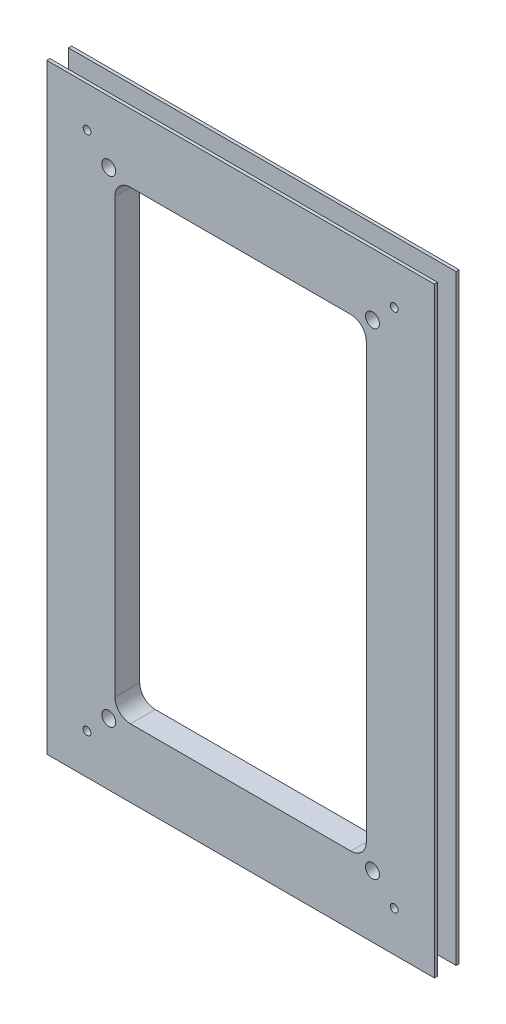
ISO-10303-21;
HEADER;
FILE_DESCRIPTION(('STEP AP214'),'2;1');
FILE_NAME('part.step','',(''),(''),'','','');
FILE_SCHEMA(('AUTOMOTIVE_DESIGN { 1 0 10303 214 1 1 1 1 }'));
ENDSEC;
DATA;
#1=APPLICATION_CONTEXT('core data for automotive mechanical design processes');
#2=APPLICATION_PROTOCOL_DEFINITION('international standard','automotive_design',2000,#1);
#3=PRODUCT_CONTEXT('',#1,'mechanical');
#4=PRODUCT('Part','Part','',(#3));
#5=PRODUCT_RELATED_PRODUCT_CATEGORY('part','',(#4));
#6=PRODUCT_DEFINITION_FORMATION('','',#4);
#7=PRODUCT_DEFINITION_CONTEXT('part definition',#1,'design');
#8=PRODUCT_DEFINITION('design','',#6,#7);
#9=PRODUCT_DEFINITION_SHAPE('','',#8);
#10=(LENGTH_UNIT() NAMED_UNIT(*) SI_UNIT(.MILLI.,.METRE.));
#11=(NAMED_UNIT(*) PLANE_ANGLE_UNIT() SI_UNIT($,.RADIAN.));
#12=(NAMED_UNIT(*) SI_UNIT($,.STERADIAN.) SOLID_ANGLE_UNIT());
#13=UNCERTAINTY_MEASURE_WITH_UNIT(LENGTH_MEASURE(1.E-05),#10,'distance_accuracy_value','');
#14=(GEOMETRIC_REPRESENTATION_CONTEXT(3) GLOBAL_UNCERTAINTY_ASSIGNED_CONTEXT((#13)) GLOBAL_UNIT_ASSIGNED_CONTEXT((#10,
#11,#12)) REPRESENTATION_CONTEXT('',''));
#15=CARTESIAN_POINT('',(0.,0.,0.));
#16=DIRECTION('',(0.,0.,1.));
#17=DIRECTION('',(1.,0.,0.));
#18=AXIS2_PLACEMENT_3D('',#15,#16,#17);
#19=CARTESIAN_POINT('',(0.,0.,-6.));
#20=DIRECTION('',(0.,0.,1.));
#21=DIRECTION('',(1.,0.,0.));
#22=AXIS2_PLACEMENT_3D('',#19,#20,#21);
#23=PLANE('',#22);
#24=DIRECTION('',(0.,1.,0.));
#25=VECTOR('',#24,1.);
#26=CARTESIAN_POINT('',(-125.15,-194.,-6.));
#27=LINE('',#26,#25);
#28=CARTESIAN_POINT('',(-125.15,194.,-6.));
#29=VERTEX_POINT('',#28);
#30=CARTESIAN_POINT('',(-125.15,-194.,-6.));
#31=VERTEX_POINT('',#30);
#32=EDGE_CURVE('E297',#29,#31,#27,.F.);
#33=ORIENTED_EDGE('',*,*,#32,.T.);
#34=DIRECTION('',(1.,0.,0.));
#35=VECTOR('',#34,1.);
#36=CARTESIAN_POINT('',(-125.15,-194.,-6.));
#37=LINE('',#36,#35);
#38=CARTESIAN_POINT('',(125.15,-194.,-6.));
#39=VERTEX_POINT('',#38);
#40=EDGE_CURVE('E291',#31,#39,#37,.T.);
#41=ORIENTED_EDGE('',*,*,#40,.T.);
#42=DIRECTION('',(0.,1.,0.));
#43=VECTOR('',#42,1.);
#44=CARTESIAN_POINT('',(125.15,-194.,-6.));
#45=LINE('',#44,#43);
#46=CARTESIAN_POINT('',(125.15,194.,-6.));
#47=VERTEX_POINT('',#46);
#48=EDGE_CURVE('E285',#39,#47,#45,.T.);
#49=ORIENTED_EDGE('',*,*,#48,.T.);
#50=DIRECTION('',(1.,0.,0.));
#51=VECTOR('',#50,1.);
#52=CARTESIAN_POINT('',(-125.15,194.,-6.));
#53=LINE('',#52,#51);
#54=EDGE_CURVE('E266',#47,#29,#53,.F.);
#55=ORIENTED_EDGE('',*,*,#54,.T.);
#56=EDGE_LOOP('',(#33,#41,#49,#55));
#57=FACE_BOUND('',#56,.T.);
#58=DIRECTION('',(0.,1.,0.));
#59=VECTOR('',#58,1.);
#60=CARTESIAN_POINT('',(-112.15,-181.,-6.));
#61=LINE('',#60,#59);
#62=CARTESIAN_POINT('',(-112.15,171.,-6.));
#63=VERTEX_POINT('',#62);
#64=CARTESIAN_POINT('',(-112.15,-171.,-6.));
#65=VERTEX_POINT('',#64);
#66=EDGE_CURVE('E163',#63,#65,#61,.F.);
#67=ORIENTED_EDGE('',*,*,#66,.F.);
#68=CARTESIAN_POINT('',(-102.15,171.,-6.));
#69=DIRECTION('',(0.,0.,1.));
#70=DIRECTION('',(1.,0.,0.));
#71=AXIS2_PLACEMENT_3D('',#68,#69,#70);
#72=CIRCLE('',#71,9.99999999999999);
#73=CARTESIAN_POINT('',(-102.15,181.,-6.));
#74=VERTEX_POINT('',#73);
#75=EDGE_CURVE('E267',#74,#63,#72,.T.);
#76=ORIENTED_EDGE('',*,*,#75,.F.);
#77=DIRECTION('',(1.,0.,0.));
#78=VECTOR('',#77,1.);
#79=CARTESIAN_POINT('',(112.15,181.,-6.));
#80=LINE('',#79,#78);
#81=CARTESIAN_POINT('',(102.15,181.,-6.));
#82=VERTEX_POINT('',#81);
#83=EDGE_CURVE('E148',#82,#74,#80,.F.);
#84=ORIENTED_EDGE('',*,*,#83,.F.);
#85=CARTESIAN_POINT('',(102.15,171.,-6.));
#86=DIRECTION('',(0.,0.,1.));
#87=DIRECTION('',(1.,0.,0.));
#88=AXIS2_PLACEMENT_3D('',#85,#86,#87);
#89=CIRCLE('',#88,9.99999999999999);
#90=CARTESIAN_POINT('',(112.15,171.,-6.));
#91=VERTEX_POINT('',#90);
#92=EDGE_CURVE('E19',#91,#82,#89,.T.);
#93=ORIENTED_EDGE('',*,*,#92,.F.);
#94=DIRECTION('',(0.,1.,0.));
#95=VECTOR('',#94,1.);
#96=CARTESIAN_POINT('',(112.15,-181.,-6.));
#97=LINE('',#96,#95);
#98=CARTESIAN_POINT('',(112.15,-171.,-6.));
#99=VERTEX_POINT('',#98);
#100=EDGE_CURVE('E133',#99,#91,#97,.T.);
#101=ORIENTED_EDGE('',*,*,#100,.F.);
#102=CARTESIAN_POINT('',(102.15,-171.,-6.));
#103=DIRECTION('',(0.,0.,1.));
#104=DIRECTION('',(1.,0.,0.));
#105=AXIS2_PLACEMENT_3D('',#102,#103,#104);
#106=CIRCLE('',#105,9.99999999999999);
#107=CARTESIAN_POINT('',(102.15,-181.,-6.));
#108=VERTEX_POINT('',#107);
#109=EDGE_CURVE('E155',#108,#99,#106,.T.);
#110=ORIENTED_EDGE('',*,*,#109,.F.);
#111=DIRECTION('',(1.,0.,0.));
#112=VECTOR('',#111,1.);
#113=CARTESIAN_POINT('',(112.15,-181.,-6.));
#114=LINE('',#113,#112);
#115=CARTESIAN_POINT('',(-102.15,-181.,-6.));
#116=VERTEX_POINT('',#115);
#117=EDGE_CURVE('E167',#116,#108,#114,.T.);
#118=ORIENTED_EDGE('',*,*,#117,.F.);
#119=CARTESIAN_POINT('',(-102.15,-171.,-6.));
#120=DIRECTION('',(0.,0.,1.));
#121=DIRECTION('',(1.,0.,0.));
#122=AXIS2_PLACEMENT_3D('',#119,#120,#121);
#123=CIRCLE('',#122,9.99999999999999);
#124=EDGE_CURVE('E270',#65,#116,#123,.T.);
#125=ORIENTED_EDGE('',*,*,#124,.F.);
#126=EDGE_LOOP('',(#67,#76,#84,#93,#101,#110,#118,#125));
#127=FACE_BOUND('',#126,.T.);
#128=ADVANCED_FACE('F16',(#57,#127),#23,.T.);
#129=CARTESIAN_POINT('',(102.15,171.,-6.));
#130=DIRECTION('',(0.,0.,1.));
#131=DIRECTION('',(1.,0.,0.));
#132=AXIS2_PLACEMENT_3D('',#129,#130,#131);
#133=CYLINDRICAL_SURFACE('',#132,9.99999999999999);
#134=CARTESIAN_POINT('',(102.15,171.,6.));
#135=DIRECTION('',(0.,0.,1.));
#136=DIRECTION('',(1.,0.,0.));
#137=AXIS2_PLACEMENT_3D('',#134,#135,#136);
#138=CIRCLE('',#137,9.99999999999999);
#139=CARTESIAN_POINT('',(102.15,181.,6.));
#140=VERTEX_POINT('',#139);
#141=CARTESIAN_POINT('',(112.15,171.,6.));
#142=VERTEX_POINT('',#141);
#143=EDGE_CURVE('E154',#140,#142,#138,.F.);
#144=ORIENTED_EDGE('',*,*,#143,.T.);
#145=DIRECTION('',(0.,0.,-1.));
#146=VECTOR('',#145,1.);
#147=CARTESIAN_POINT('',(112.15,171.,-6.));
#148=LINE('',#147,#146);
#149=EDGE_CURVE('E138',#91,#142,#148,.F.);
#150=ORIENTED_EDGE('',*,*,#149,.F.);
#151=ORIENTED_EDGE('',*,*,#92,.T.);
#152=DIRECTION('',(0.,0.,1.));
#153=VECTOR('',#152,1.);
#154=CARTESIAN_POINT('',(102.15,181.,-6.));
#155=LINE('',#154,#153);
#156=EDGE_CURVE('E162',#140,#82,#155,.F.);
#157=ORIENTED_EDGE('',*,*,#156,.F.);
#158=EDGE_LOOP('',(#144,#150,#151,#157));
#159=FACE_BOUND('',#158,.T.);
#160=ADVANCED_FACE('F153',(#159),#133,.T.);
#161=CARTESIAN_POINT('',(112.15,-181.,-6.));
#162=DIRECTION('',(1.,0.,0.));
#163=DIRECTION('',(0.,0.,-1.));
#164=AXIS2_PLACEMENT_3D('',#161,#162,#163);
#165=PLANE('',#164);
#166=ORIENTED_EDGE('',*,*,#100,.T.);
#167=ORIENTED_EDGE('',*,*,#149,.T.);
#168=DIRECTION('',(0.,1.,0.));
#169=VECTOR('',#168,1.);
#170=CARTESIAN_POINT('',(112.15,0.,6.));
#171=LINE('',#170,#169);
#172=CARTESIAN_POINT('',(112.15,-171.,6.));
#173=VERTEX_POINT('',#172);
#174=EDGE_CURVE('E264',#142,#173,#171,.F.);
#175=ORIENTED_EDGE('',*,*,#174,.T.);
#176=DIRECTION('',(0.,0.,1.));
#177=VECTOR('',#176,1.);
#178=CARTESIAN_POINT('',(112.15,-171.,-6.));
#179=LINE('',#178,#177);
#180=EDGE_CURVE('E140',#99,#173,#179,.T.);
#181=ORIENTED_EDGE('',*,*,#180,.F.);
#182=EDGE_LOOP('',(#166,#167,#175,#181));
#183=FACE_BOUND('',#182,.T.);
#184=ADVANCED_FACE('F135',(#183),#165,.T.);
#185=CARTESIAN_POINT('',(102.15,-171.,-6.));
#186=DIRECTION('',(0.,0.,1.));
#187=DIRECTION('',(1.,0.,0.));
#188=AXIS2_PLACEMENT_3D('',#185,#186,#187);
#189=CYLINDRICAL_SURFACE('',#188,9.99999999999999);
#190=CARTESIAN_POINT('',(102.15,-171.,6.));
#191=DIRECTION('',(0.,0.,1.));
#192=DIRECTION('',(1.,0.,0.));
#193=AXIS2_PLACEMENT_3D('',#190,#191,#192);
#194=CIRCLE('',#193,9.99999999999999);
#195=CARTESIAN_POINT('',(102.15,-181.,6.));
#196=VERTEX_POINT('',#195);
#197=EDGE_CURVE('E261',#173,#196,#194,.F.);
#198=ORIENTED_EDGE('',*,*,#197,.T.);
#199=DIRECTION('',(0.,0.,-1.));
#200=VECTOR('',#199,1.);
#201=CARTESIAN_POINT('',(102.15,-181.,-6.));
#202=LINE('',#201,#200);
#203=EDGE_CURVE('E168',#108,#196,#202,.F.);
#204=ORIENTED_EDGE('',*,*,#203,.F.);
#205=ORIENTED_EDGE('',*,*,#109,.T.);
#206=ORIENTED_EDGE('',*,*,#180,.T.);
#207=EDGE_LOOP('',(#198,#204,#205,#206));
#208=FACE_BOUND('',#207,.T.);
#209=ADVANCED_FACE('F551',(#208),#189,.T.);
#210=CARTESIAN_POINT('',(112.15,-181.,-6.));
#211=DIRECTION('',(0.,-1.,0.));
#212=DIRECTION('',(0.,0.,-1.));
#213=AXIS2_PLACEMENT_3D('',#210,#211,#212);
#214=PLANE('',#213);
#215=DIRECTION('',(1.,0.,0.));
#216=VECTOR('',#215,1.);
#217=CARTESIAN_POINT('',(0.,-181.,6.));
#218=LINE('',#217,#216);
#219=CARTESIAN_POINT('',(-102.15,-181.,6.));
#220=VERTEX_POINT('',#219);
#221=EDGE_CURVE('E260',#196,#220,#218,.F.);
#222=ORIENTED_EDGE('',*,*,#221,.T.);
#223=DIRECTION('',(0.,0.,1.));
#224=VECTOR('',#223,1.);
#225=CARTESIAN_POINT('',(-102.15,-181.,-6.));
#226=LINE('',#225,#224);
#227=EDGE_CURVE('E166',#116,#220,#226,.T.);
#228=ORIENTED_EDGE('',*,*,#227,.F.);
#229=ORIENTED_EDGE('',*,*,#117,.T.);
#230=ORIENTED_EDGE('',*,*,#203,.T.);
#231=EDGE_LOOP('',(#222,#228,#229,#230));
#232=FACE_BOUND('',#231,.T.);
#233=ADVANCED_FACE('F548',(#232),#214,.T.);
#234=CARTESIAN_POINT('',(-102.15,-171.,-6.));
#235=DIRECTION('',(0.,0.,1.));
#236=DIRECTION('',(1.,0.,0.));
#237=AXIS2_PLACEMENT_3D('',#234,#235,#236);
#238=CYLINDRICAL_SURFACE('',#237,9.99999999999999);
#239=CARTESIAN_POINT('',(-102.15,-171.,6.));
#240=DIRECTION('',(0.,0.,1.));
#241=DIRECTION('',(1.,0.,0.));
#242=AXIS2_PLACEMENT_3D('',#239,#240,#241);
#243=CIRCLE('',#242,9.99999999999999);
#244=CARTESIAN_POINT('',(-112.15,-171.,6.));
#245=VERTEX_POINT('',#244);
#246=EDGE_CURVE('E257',#220,#245,#243,.F.);
#247=ORIENTED_EDGE('',*,*,#246,.T.);
#248=DIRECTION('',(0.,0.,1.));
#249=VECTOR('',#248,1.);
#250=CARTESIAN_POINT('',(-112.15,-171.,-6.));
#251=LINE('',#250,#249);
#252=EDGE_CURVE('E165',#65,#245,#251,.T.);
#253=ORIENTED_EDGE('',*,*,#252,.F.);
#254=ORIENTED_EDGE('',*,*,#124,.T.);
#255=ORIENTED_EDGE('',*,*,#227,.T.);
#256=EDGE_LOOP('',(#247,#253,#254,#255));
#257=FACE_BOUND('',#256,.T.);
#258=ADVANCED_FACE('F544',(#257),#238,.T.);
#259=CARTESIAN_POINT('',(-112.15,-181.,-6.));
#260=DIRECTION('',(-1.,0.,0.));
#261=DIRECTION('',(0.,0.,1.));
#262=AXIS2_PLACEMENT_3D('',#259,#260,#261);
#263=PLANE('',#262);
#264=DIRECTION('',(0.,1.,0.));
#265=VECTOR('',#264,1.);
#266=CARTESIAN_POINT('',(-112.15,0.,6.));
#267=LINE('',#266,#265);
#268=CARTESIAN_POINT('',(-112.15,171.,6.));
#269=VERTEX_POINT('',#268);
#270=EDGE_CURVE('E256',#245,#269,#267,.T.);
#271=ORIENTED_EDGE('',*,*,#270,.T.);
#272=DIRECTION('',(0.,0.,1.));
#273=VECTOR('',#272,1.);
#274=CARTESIAN_POINT('',(-112.15,171.,-6.));
#275=LINE('',#274,#273);
#276=EDGE_CURVE('E269',#63,#269,#275,.T.);
#277=ORIENTED_EDGE('',*,*,#276,.F.);
#278=ORIENTED_EDGE('',*,*,#66,.T.);
#279=ORIENTED_EDGE('',*,*,#252,.T.);
#280=EDGE_LOOP('',(#271,#277,#278,#279));
#281=FACE_BOUND('',#280,.T.);
#282=ADVANCED_FACE('F540',(#281),#263,.T.);
#283=CARTESIAN_POINT('',(-102.15,171.,-6.));
#284=DIRECTION('',(0.,0.,1.));
#285=DIRECTION('',(1.,0.,0.));
#286=AXIS2_PLACEMENT_3D('',#283,#284,#285);
#287=CYLINDRICAL_SURFACE('',#286,9.99999999999999);
#288=CARTESIAN_POINT('',(-102.15,171.,6.));
#289=DIRECTION('',(0.,0.,1.));
#290=DIRECTION('',(1.,0.,0.));
#291=AXIS2_PLACEMENT_3D('',#288,#289,#290);
#292=CIRCLE('',#291,9.99999999999999);
#293=CARTESIAN_POINT('',(-102.15,181.,6.));
#294=VERTEX_POINT('',#293);
#295=EDGE_CURVE('E252',#269,#294,#292,.F.);
#296=ORIENTED_EDGE('',*,*,#295,.T.);
#297=DIRECTION('',(0.,0.,1.));
#298=VECTOR('',#297,1.);
#299=CARTESIAN_POINT('',(-102.15,181.,-6.));
#300=LINE('',#299,#298);
#301=EDGE_CURVE('E161',#74,#294,#300,.T.);
#302=ORIENTED_EDGE('',*,*,#301,.F.);
#303=ORIENTED_EDGE('',*,*,#75,.T.);
#304=ORIENTED_EDGE('',*,*,#276,.T.);
#305=EDGE_LOOP('',(#296,#302,#303,#304));
#306=FACE_BOUND('',#305,.T.);
#307=ADVANCED_FACE('F536',(#306),#287,.T.);
#308=CARTESIAN_POINT('',(112.15,181.,-6.));
#309=DIRECTION('',(0.,1.,0.));
#310=DIRECTION('',(0.,0.,1.));
#311=AXIS2_PLACEMENT_3D('',#308,#309,#310);
#312=PLANE('',#311);
#313=ORIENTED_EDGE('',*,*,#83,.T.);
#314=ORIENTED_EDGE('',*,*,#301,.T.);
#315=DIRECTION('',(1.,0.,0.));
#316=VECTOR('',#315,1.);
#317=CARTESIAN_POINT('',(0.,181.,6.));
#318=LINE('',#317,#316);
#319=EDGE_CURVE('E255',#294,#140,#318,.T.);
#320=ORIENTED_EDGE('',*,*,#319,.T.);
#321=ORIENTED_EDGE('',*,*,#156,.T.);
#322=EDGE_LOOP('',(#313,#314,#320,#321));
#323=FACE_BOUND('',#322,.T.);
#324=ADVANCED_FACE('F532',(#323),#312,.T.);
#325=CARTESIAN_POINT('',(125.15,-194.,8.));
#326=DIRECTION('',(-1.,0.,0.));
#327=DIRECTION('',(0.,0.,1.));
#328=AXIS2_PLACEMENT_3D('',#325,#326,#327);
#329=PLANE('',#328);
#330=DIRECTION('',(0.,0.,1.));
#331=VECTOR('',#330,1.);
#332=CARTESIAN_POINT('',(125.15,-194.,8.));
#333=LINE('',#332,#331);
#334=CARTESIAN_POINT('',(125.15,-194.,-8.));
#335=VERTEX_POINT('',#334);
#336=EDGE_CURVE('E288',#39,#335,#333,.F.);
#337=ORIENTED_EDGE('',*,*,#336,.T.);
#338=DIRECTION('',(0.,1.,0.));
#339=VECTOR('',#338,1.);
#340=CARTESIAN_POINT('',(125.15,0.,-8.));
#341=LINE('',#340,#339);
#342=CARTESIAN_POINT('',(125.15,194.,-8.));
#343=VERTEX_POINT('',#342);
#344=EDGE_CURVE('E314',#343,#335,#341,.F.);
#345=ORIENTED_EDGE('',*,*,#344,.F.);
#346=DIRECTION('',(0.,0.,-1.));
#347=VECTOR('',#346,1.);
#348=CARTESIAN_POINT('',(125.15,194.,8.));
#349=LINE('',#348,#347);
#350=EDGE_CURVE('E303',#343,#47,#349,.F.);
#351=ORIENTED_EDGE('',*,*,#350,.T.);
#352=ORIENTED_EDGE('',*,*,#48,.F.);
#353=EDGE_LOOP('',(#337,#345,#351,#352));
#354=FACE_BOUND('',#353,.T.);
#355=ADVANCED_FACE('F528',(#354),#329,.F.);
#356=CARTESIAN_POINT('',(-125.15,-194.,8.));
#357=DIRECTION('',(0.,1.,0.));
#358=DIRECTION('',(0.,0.,1.));
#359=AXIS2_PLACEMENT_3D('',#356,#357,#358);
#360=PLANE('',#359);
#361=DIRECTION('',(0.,0.,-1.));
#362=VECTOR('',#361,1.);
#363=CARTESIAN_POINT('',(-125.15,-194.,8.));
#364=LINE('',#363,#362);
#365=CARTESIAN_POINT('',(-125.15,-194.,-8.));
#366=VERTEX_POINT('',#365);
#367=EDGE_CURVE('E294',#31,#366,#364,.T.);
#368=ORIENTED_EDGE('',*,*,#367,.T.);
#369=DIRECTION('',(-1.,0.,0.));
#370=VECTOR('',#369,1.);
#371=CARTESIAN_POINT('',(0.,-194.,-8.));
#372=LINE('',#371,#370);
#373=EDGE_CURVE('E323',#335,#366,#372,.T.);
#374=ORIENTED_EDGE('',*,*,#373,.F.);
#375=ORIENTED_EDGE('',*,*,#336,.F.);
#376=ORIENTED_EDGE('',*,*,#40,.F.);
#377=EDGE_LOOP('',(#368,#374,#375,#376));
#378=FACE_BOUND('',#377,.T.);
#379=ADVANCED_FACE('F524',(#378),#360,.F.);
#380=CARTESIAN_POINT('',(-125.15,-194.,8.));
#381=DIRECTION('',(1.,0.,0.));
#382=DIRECTION('',(0.,0.,-1.));
#383=AXIS2_PLACEMENT_3D('',#380,#381,#382);
#384=PLANE('',#383);
#385=DIRECTION('',(0.,0.,-1.));
#386=VECTOR('',#385,1.);
#387=CARTESIAN_POINT('',(-125.15,194.,8.));
#388=LINE('',#387,#386);
#389=CARTESIAN_POINT('',(-125.15,194.,-8.));
#390=VERTEX_POINT('',#389);
#391=EDGE_CURVE('E300',#29,#390,#388,.T.);
#392=ORIENTED_EDGE('',*,*,#391,.T.);
#393=DIRECTION('',(0.,1.,0.));
#394=VECTOR('',#393,1.);
#395=CARTESIAN_POINT('',(-125.15,0.,-8.));
#396=LINE('',#395,#394);
#397=EDGE_CURVE('E326',#366,#390,#396,.T.);
#398=ORIENTED_EDGE('',*,*,#397,.F.);
#399=ORIENTED_EDGE('',*,*,#367,.F.);
#400=ORIENTED_EDGE('',*,*,#32,.F.);
#401=EDGE_LOOP('',(#392,#398,#399,#400));
#402=FACE_BOUND('',#401,.T.);
#403=ADVANCED_FACE('F520',(#402),#384,.F.);
#404=CARTESIAN_POINT('',(-125.15,194.,8.));
#405=DIRECTION('',(0.,-1.,0.));
#406=DIRECTION('',(0.,0.,-1.));
#407=AXIS2_PLACEMENT_3D('',#404,#405,#406);
#408=PLANE('',#407);
#409=ORIENTED_EDGE('',*,*,#350,.F.);
#410=DIRECTION('',(-1.,0.,0.));
#411=VECTOR('',#410,1.);
#412=CARTESIAN_POINT('',(0.,194.,-8.));
#413=LINE('',#412,#411);
#414=EDGE_CURVE('E251',#390,#343,#413,.F.);
#415=ORIENTED_EDGE('',*,*,#414,.F.);
#416=ORIENTED_EDGE('',*,*,#391,.F.);
#417=ORIENTED_EDGE('',*,*,#54,.F.);
#418=EDGE_LOOP('',(#409,#415,#416,#417));
#419=FACE_BOUND('',#418,.T.);
#420=ADVANCED_FACE('F516',(#419),#408,.F.);
#421=CARTESIAN_POINT('',(0.,0.,6.));
#422=DIRECTION('',(0.,0.,1.));
#423=DIRECTION('',(1.,0.,0.));
#424=AXIS2_PLACEMENT_3D('',#421,#422,#423);
#425=PLANE('',#424);
#426=DIRECTION('',(0.,1.,0.));
#427=VECTOR('',#426,1.);
#428=CARTESIAN_POINT('',(-125.15,-194.,6.));
#429=LINE('',#428,#427);
#430=CARTESIAN_POINT('',(-125.15,-194.,6.));
#431=VERTEX_POINT('',#430);
#432=CARTESIAN_POINT('',(-125.15,194.,6.));
#433=VERTEX_POINT('',#432);
#434=EDGE_CURVE('E339',#431,#433,#429,.T.);
#435=ORIENTED_EDGE('',*,*,#434,.T.);
#436=DIRECTION('',(1.,0.,0.));
#437=VECTOR('',#436,1.);
#438=CARTESIAN_POINT('',(-125.15,194.,6.));
#439=LINE('',#438,#437);
#440=CARTESIAN_POINT('',(125.15,194.,6.));
#441=VERTEX_POINT('',#440);
#442=EDGE_CURVE('E345',#433,#441,#439,.T.);
#443=ORIENTED_EDGE('',*,*,#442,.T.);
#444=DIRECTION('',(0.,1.,0.));
#445=VECTOR('',#444,1.);
#446=CARTESIAN_POINT('',(125.15,-194.,6.));
#447=LINE('',#446,#445);
#448=CARTESIAN_POINT('',(125.15,-194.,6.));
#449=VERTEX_POINT('',#448);
#450=EDGE_CURVE('E351',#441,#449,#447,.F.);
#451=ORIENTED_EDGE('',*,*,#450,.T.);
#452=DIRECTION('',(1.,0.,0.));
#453=VECTOR('',#452,1.);
#454=CARTESIAN_POINT('',(-125.15,-194.,6.));
#455=LINE('',#454,#453);
#456=EDGE_CURVE('E229',#449,#431,#455,.F.);
#457=ORIENTED_EDGE('',*,*,#456,.T.);
#458=EDGE_LOOP('',(#435,#443,#451,#457));
#459=FACE_BOUND('',#458,.T.);
#460=ORIENTED_EDGE('',*,*,#295,.F.);
#461=ORIENTED_EDGE('',*,*,#270,.F.);
#462=ORIENTED_EDGE('',*,*,#246,.F.);
#463=ORIENTED_EDGE('',*,*,#221,.F.);
#464=ORIENTED_EDGE('',*,*,#197,.F.);
#465=ORIENTED_EDGE('',*,*,#174,.F.);
#466=ORIENTED_EDGE('',*,*,#143,.F.);
#467=ORIENTED_EDGE('',*,*,#319,.F.);
#468=EDGE_LOOP('',(#460,#461,#462,#463,#464,#465,#466,#467));
#469=FACE_BOUND('',#468,.T.);
#470=ADVANCED_FACE('F422',(#459,#469),#425,.F.);
#471=CARTESIAN_POINT('',(0.,0.,-8.));
#472=DIRECTION('',(0.,0.,-1.));
#473=DIRECTION('',(-1.,0.,0.));
#474=AXIS2_PLACEMENT_3D('',#471,#472,#473);
#475=PLANE('',#474);
#476=DIRECTION('',(-1.,0.,0.));
#477=VECTOR('',#476,1.);
#478=CARTESIAN_POINT('',(81.15,150.,-8.00000000000001));
#479=LINE('',#478,#477);
#480=CARTESIAN_POINT('',(71.15,150.,-8.00000000000001));
#481=VERTEX_POINT('',#480);
#482=CARTESIAN_POINT('',(-71.15,150.,-8.00000000000001));
#483=VERTEX_POINT('',#482);
#484=EDGE_CURVE('E315',#481,#483,#479,.T.);
#485=ORIENTED_EDGE('',*,*,#484,.T.);
#486=CARTESIAN_POINT('',(-71.15,140.,-8.00000000000001));
#487=DIRECTION('',(0.,0.,-1.));
#488=DIRECTION('',(-1.,0.,0.));
#489=AXIS2_PLACEMENT_3D('',#486,#487,#488);
#490=CIRCLE('',#489,9.99999999999999);
#491=CARTESIAN_POINT('',(-81.15,140.,-8.00000000000001));
#492=VERTEX_POINT('',#491);
#493=EDGE_CURVE('E218',#483,#492,#490,.F.);
#494=ORIENTED_EDGE('',*,*,#493,.T.);
#495=DIRECTION('',(0.,-1.,0.));
#496=VECTOR('',#495,1.);
#497=CARTESIAN_POINT('',(-81.15,150.,-8.00000000000001));
#498=LINE('',#497,#496);
#499=CARTESIAN_POINT('',(-81.15,-140.,-8.00000000000001));
#500=VERTEX_POINT('',#499);
#501=EDGE_CURVE('E317',#492,#500,#498,.T.);
#502=ORIENTED_EDGE('',*,*,#501,.T.);
#503=CARTESIAN_POINT('',(-71.15,-140.,-8.00000000000001));
#504=DIRECTION('',(0.,0.,-1.));
#505=DIRECTION('',(-1.,0.,0.));
#506=AXIS2_PLACEMENT_3D('',#503,#504,#505);
#507=CIRCLE('',#506,9.99999999999999);
#508=CARTESIAN_POINT('',(-71.15,-150.,-8.00000000000001));
#509=VERTEX_POINT('',#508);
#510=EDGE_CURVE('E214',#500,#509,#507,.F.);
#511=ORIENTED_EDGE('',*,*,#510,.T.);
#512=DIRECTION('',(1.,0.,0.));
#513=VECTOR('',#512,1.);
#514=CARTESIAN_POINT('',(-81.15,-150.,-8.00000000000001));
#515=LINE('',#514,#513);
#516=CARTESIAN_POINT('',(71.15,-150.,-8.00000000000001));
#517=VERTEX_POINT('',#516);
#518=EDGE_CURVE('E319',#509,#517,#515,.T.);
#519=ORIENTED_EDGE('',*,*,#518,.T.);
#520=CARTESIAN_POINT('',(71.15,-140.,-8.00000000000001));
#521=DIRECTION('',(0.,0.,-1.));
#522=DIRECTION('',(-1.,0.,0.));
#523=AXIS2_PLACEMENT_3D('',#520,#521,#522);
#524=CIRCLE('',#523,10.);
#525=CARTESIAN_POINT('',(81.15,-140.,-8.00000000000001));
#526=VERTEX_POINT('',#525);
#527=EDGE_CURVE('E211',#517,#526,#524,.F.);
#528=ORIENTED_EDGE('',*,*,#527,.T.);
#529=DIRECTION('',(0.,1.,0.));
#530=VECTOR('',#529,1.);
#531=CARTESIAN_POINT('',(81.15,-150.,-8.00000000000001));
#532=LINE('',#531,#530);
#533=CARTESIAN_POINT('',(81.15,140.,-8.00000000000001));
#534=VERTEX_POINT('',#533);
#535=EDGE_CURVE('E331',#526,#534,#532,.T.);
#536=ORIENTED_EDGE('',*,*,#535,.T.);
#537=CARTESIAN_POINT('',(71.15,140.,-8.00000000000001));
#538=DIRECTION('',(0.,0.,-1.));
#539=DIRECTION('',(-1.,0.,0.));
#540=AXIS2_PLACEMENT_3D('',#537,#538,#539);
#541=CIRCLE('',#540,10.);
#542=EDGE_CURVE('E222',#534,#481,#541,.F.);
#543=ORIENTED_EDGE('',*,*,#542,.T.);
#544=EDGE_LOOP('',(#485,#494,#502,#511,#519,#528,#536,#543));
#545=FACE_BOUND('',#544,.T.);
#546=ORIENTED_EDGE('',*,*,#397,.T.);
#547=ORIENTED_EDGE('',*,*,#414,.T.);
#548=ORIENTED_EDGE('',*,*,#344,.T.);
#549=ORIENTED_EDGE('',*,*,#373,.T.);
#550=EDGE_LOOP('',(#546,#547,#548,#549));
#551=FACE_BOUND('',#550,.T.);
#552=CARTESIAN_POINT('',(99.15,168.,-8.00000000000001));
#553=DIRECTION('',(0.,0.,1.));
#554=DIRECTION('',(1.,0.,0.));
#555=AXIS2_PLACEMENT_3D('',#552,#553,#554);
#556=CIRCLE('',#555,2.5);
#557=CARTESIAN_POINT('',(101.65,168.,-8.00000000000001));
#558=VERTEX_POINT('',#557);
#559=EDGE_CURVE('E226',#558,#558,#556,.T.);
#560=ORIENTED_EDGE('',*,*,#559,.T.);
#561=EDGE_LOOP('',(#560));
#562=FACE_BOUND('',#561,.T.);
#563=CARTESIAN_POINT('',(99.15,-168.,-8.00000000000001));
#564=DIRECTION('',(0.,0.,1.));
#565=DIRECTION('',(1.,0.,0.));
#566=AXIS2_PLACEMENT_3D('',#563,#564,#565);
#567=CIRCLE('',#566,2.5);
#568=CARTESIAN_POINT('',(101.65,-168.,-8.00000000000001));
#569=VERTEX_POINT('',#568);
#570=EDGE_CURVE('E230',#569,#569,#567,.T.);
#571=ORIENTED_EDGE('',*,*,#570,.T.);
#572=EDGE_LOOP('',(#571));
#573=FACE_BOUND('',#572,.T.);
#574=CARTESIAN_POINT('',(-99.15,-168.,-8.00000000000001));
#575=DIRECTION('',(0.,0.,1.));
#576=DIRECTION('',(1.,0.,0.));
#577=AXIS2_PLACEMENT_3D('',#574,#575,#576);
#578=CIRCLE('',#577,2.5);
#579=CARTESIAN_POINT('',(-96.65,-168.,-8.00000000000001));
#580=VERTEX_POINT('',#579);
#581=EDGE_CURVE('E233',#580,#580,#578,.T.);
#582=ORIENTED_EDGE('',*,*,#581,.T.);
#583=EDGE_LOOP('',(#582));
#584=FACE_BOUND('',#583,.T.);
#585=CARTESIAN_POINT('',(-99.15,168.,-8.00000000000001));
#586=DIRECTION('',(0.,0.,1.));
#587=DIRECTION('',(1.,0.,0.));
#588=AXIS2_PLACEMENT_3D('',#585,#586,#587);
#589=CIRCLE('',#588,2.5);
#590=CARTESIAN_POINT('',(-96.65,168.,-8.00000000000001));
#591=VERTEX_POINT('',#590);
#592=EDGE_CURVE('E236',#591,#591,#589,.T.);
#593=ORIENTED_EDGE('',*,*,#592,.T.);
#594=EDGE_LOOP('',(#593));
#595=FACE_BOUND('',#594,.T.);
#596=CARTESIAN_POINT('',(-85.15,154.,-8.00000000000001));
#597=DIRECTION('',(0.,0.,1.));
#598=DIRECTION('',(1.,0.,0.));
#599=AXIS2_PLACEMENT_3D('',#596,#597,#598);
#600=CIRCLE('',#599,4.5);
#601=CARTESIAN_POINT('',(-80.65,154.,-8.00000000000001));
#602=VERTEX_POINT('',#601);
#603=EDGE_CURVE('E239',#602,#602,#600,.T.);
#604=ORIENTED_EDGE('',*,*,#603,.T.);
#605=EDGE_LOOP('',(#604));
#606=FACE_BOUND('',#605,.T.);
#607=CARTESIAN_POINT('',(-85.15,-154.,-8.00000000000001));
#608=DIRECTION('',(0.,0.,1.));
#609=DIRECTION('',(1.,0.,0.));
#610=AXIS2_PLACEMENT_3D('',#607,#608,#609);
#611=CIRCLE('',#610,4.5);
#612=CARTESIAN_POINT('',(-80.65,-154.,-8.00000000000001));
#613=VERTEX_POINT('',#612);
#614=EDGE_CURVE('E242',#613,#613,#611,.T.);
#615=ORIENTED_EDGE('',*,*,#614,.T.);
#616=EDGE_LOOP('',(#615));
#617=FACE_BOUND('',#616,.T.);
#618=CARTESIAN_POINT('',(85.15,-154.,-8.00000000000001));
#619=DIRECTION('',(0.,0.,1.));
#620=DIRECTION('',(1.,0.,0.));
#621=AXIS2_PLACEMENT_3D('',#618,#619,#620);
#622=CIRCLE('',#621,4.5);
#623=CARTESIAN_POINT('',(89.65,-154.,-8.00000000000001));
#624=VERTEX_POINT('',#623);
#625=EDGE_CURVE('E245',#624,#624,#622,.T.);
#626=ORIENTED_EDGE('',*,*,#625,.T.);
#627=EDGE_LOOP('',(#626));
#628=FACE_BOUND('',#627,.T.);
#629=CARTESIAN_POINT('',(85.15,154.,-8.00000000000001));
#630=DIRECTION('',(0.,0.,1.));
#631=DIRECTION('',(1.,0.,0.));
#632=AXIS2_PLACEMENT_3D('',#629,#630,#631);
#633=CIRCLE('',#632,4.5);
#634=CARTESIAN_POINT('',(89.65,154.,-8.00000000000001));
#635=VERTEX_POINT('',#634);
#636=EDGE_CURVE('E248',#635,#635,#633,.T.);
#637=ORIENTED_EDGE('',*,*,#636,.T.);
#638=EDGE_LOOP('',(#637));
#639=FACE_BOUND('',#638,.T.);
#640=ADVANCED_FACE('F418',(#545,#551,#562,#573,#584,#595,#606,#617,#628,#639),#475,.T.);
#641=CARTESIAN_POINT('',(85.15,154.,-8.00000000000001));
#642=DIRECTION('',(0.,0.,1.));
#643=DIRECTION('',(1.,0.,0.));
#644=AXIS2_PLACEMENT_3D('',#641,#642,#643);
#645=CYLINDRICAL_SURFACE('',#644,4.5);
#646=ORIENTED_EDGE('',*,*,#636,.F.);
#647=EDGE_LOOP('',(#646));
#648=FACE_BOUND('',#647,.T.);
#649=CARTESIAN_POINT('',(85.15,154.,8.));
#650=DIRECTION('',(0.,0.,1.));
#651=DIRECTION('',(1.,0.,0.));
#652=AXIS2_PLACEMENT_3D('',#649,#650,#651);
#653=CIRCLE('',#652,4.5);
#654=CARTESIAN_POINT('',(89.65,154.,8.));
#655=VERTEX_POINT('',#654);
#656=EDGE_CURVE('E207',#655,#655,#653,.T.);
#657=ORIENTED_EDGE('',*,*,#656,.T.);
#658=EDGE_LOOP('',(#657));
#659=FACE_BOUND('',#658,.T.);
#660=ADVANCED_FACE('F421',(#648,#659),#645,.F.);
#661=CARTESIAN_POINT('',(85.15,-154.,-8.00000000000001));
#662=DIRECTION('',(0.,0.,1.));
#663=DIRECTION('',(1.,0.,0.));
#664=AXIS2_PLACEMENT_3D('',#661,#662,#663);
#665=CYLINDRICAL_SURFACE('',#664,4.5);
#666=ORIENTED_EDGE('',*,*,#625,.F.);
#667=EDGE_LOOP('',(#666));
#668=FACE_BOUND('',#667,.T.);
#669=CARTESIAN_POINT('',(85.15,-154.,8.));
#670=DIRECTION('',(0.,0.,1.));
#671=DIRECTION('',(1.,0.,0.));
#672=AXIS2_PLACEMENT_3D('',#669,#670,#671);
#673=CIRCLE('',#672,4.5);
#674=CARTESIAN_POINT('',(89.65,-154.,8.));
#675=VERTEX_POINT('',#674);
#676=EDGE_CURVE('E204',#675,#675,#673,.T.);
#677=ORIENTED_EDGE('',*,*,#676,.T.);
#678=EDGE_LOOP('',(#677));
#679=FACE_BOUND('',#678,.T.);
#680=ADVANCED_FACE('F445',(#668,#679),#665,.F.);
#681=CARTESIAN_POINT('',(-85.15,-154.,-8.00000000000001));
#682=DIRECTION('',(0.,0.,1.));
#683=DIRECTION('',(1.,0.,0.));
#684=AXIS2_PLACEMENT_3D('',#681,#682,#683);
#685=CYLINDRICAL_SURFACE('',#684,4.5);
#686=ORIENTED_EDGE('',*,*,#614,.F.);
#687=EDGE_LOOP('',(#686));
#688=FACE_BOUND('',#687,.T.);
#689=CARTESIAN_POINT('',(-85.15,-154.,8.));
#690=DIRECTION('',(0.,0.,1.));
#691=DIRECTION('',(1.,0.,0.));
#692=AXIS2_PLACEMENT_3D('',#689,#690,#691);
#693=CIRCLE('',#692,4.5);
#694=CARTESIAN_POINT('',(-80.65,-154.,8.));
#695=VERTEX_POINT('',#694);
#696=EDGE_CURVE('E201',#695,#695,#693,.T.);
#697=ORIENTED_EDGE('',*,*,#696,.T.);
#698=EDGE_LOOP('',(#697));
#699=FACE_BOUND('',#698,.T.);
#700=ADVANCED_FACE('F506',(#688,#699),#685,.F.);
#701=CARTESIAN_POINT('',(-85.15,154.,-8.00000000000001));
#702=DIRECTION('',(0.,0.,1.));
#703=DIRECTION('',(1.,0.,0.));
#704=AXIS2_PLACEMENT_3D('',#701,#702,#703);
#705=CYLINDRICAL_SURFACE('',#704,4.5);
#706=ORIENTED_EDGE('',*,*,#603,.F.);
#707=EDGE_LOOP('',(#706));
#708=FACE_BOUND('',#707,.T.);
#709=CARTESIAN_POINT('',(-85.15,154.,8.));
#710=DIRECTION('',(0.,0.,1.));
#711=DIRECTION('',(1.,0.,0.));
#712=AXIS2_PLACEMENT_3D('',#709,#710,#711);
#713=CIRCLE('',#712,4.5);
#714=CARTESIAN_POINT('',(-80.65,154.,8.));
#715=VERTEX_POINT('',#714);
#716=EDGE_CURVE('E198',#715,#715,#713,.T.);
#717=ORIENTED_EDGE('',*,*,#716,.T.);
#718=EDGE_LOOP('',(#717));
#719=FACE_BOUND('',#718,.T.);
#720=ADVANCED_FACE('F502',(#708,#719),#705,.F.);
#721=CARTESIAN_POINT('',(-99.15,168.,8.));
#722=DIRECTION('',(0.,0.,1.));
#723=DIRECTION('',(1.,0.,0.));
#724=AXIS2_PLACEMENT_3D('',#721,#722,#723);
#725=CYLINDRICAL_SURFACE('',#724,2.5);
#726=ORIENTED_EDGE('',*,*,#592,.F.);
#727=EDGE_LOOP('',(#726));
#728=FACE_BOUND('',#727,.T.);
#729=CARTESIAN_POINT('',(-99.15,168.,8.));
#730=DIRECTION('',(0.,0.,1.));
#731=DIRECTION('',(1.,0.,0.));
#732=AXIS2_PLACEMENT_3D('',#729,#730,#731);
#733=CIRCLE('',#732,2.5);
#734=CARTESIAN_POINT('',(-96.65,168.,8.));
#735=VERTEX_POINT('',#734);
#736=EDGE_CURVE('E195',#735,#735,#733,.T.);
#737=ORIENTED_EDGE('',*,*,#736,.T.);
#738=EDGE_LOOP('',(#737));
#739=FACE_BOUND('',#738,.T.);
#740=ADVANCED_FACE('F498',(#728,#739),#725,.F.);
#741=CARTESIAN_POINT('',(-99.15,-168.,8.));
#742=DIRECTION('',(0.,0.,1.));
#743=DIRECTION('',(1.,0.,0.));
#744=AXIS2_PLACEMENT_3D('',#741,#742,#743);
#745=CYLINDRICAL_SURFACE('',#744,2.5);
#746=ORIENTED_EDGE('',*,*,#581,.F.);
#747=EDGE_LOOP('',(#746));
#748=FACE_BOUND('',#747,.T.);
#749=CARTESIAN_POINT('',(-99.15,-168.,8.));
#750=DIRECTION('',(0.,0.,1.));
#751=DIRECTION('',(1.,0.,0.));
#752=AXIS2_PLACEMENT_3D('',#749,#750,#751);
#753=CIRCLE('',#752,2.5);
#754=CARTESIAN_POINT('',(-96.65,-168.,8.));
#755=VERTEX_POINT('',#754);
#756=EDGE_CURVE('E192',#755,#755,#753,.T.);
#757=ORIENTED_EDGE('',*,*,#756,.T.);
#758=EDGE_LOOP('',(#757));
#759=FACE_BOUND('',#758,.T.);
#760=ADVANCED_FACE('F494',(#748,#759),#745,.F.);
#761=CARTESIAN_POINT('',(99.15,-168.,8.));
#762=DIRECTION('',(0.,0.,1.));
#763=DIRECTION('',(1.,0.,0.));
#764=AXIS2_PLACEMENT_3D('',#761,#762,#763);
#765=CYLINDRICAL_SURFACE('',#764,2.5);
#766=ORIENTED_EDGE('',*,*,#570,.F.);
#767=EDGE_LOOP('',(#766));
#768=FACE_BOUND('',#767,.T.);
#769=CARTESIAN_POINT('',(99.15,-168.,8.));
#770=DIRECTION('',(0.,0.,1.));
#771=DIRECTION('',(1.,0.,0.));
#772=AXIS2_PLACEMENT_3D('',#769,#770,#771);
#773=CIRCLE('',#772,2.5);
#774=CARTESIAN_POINT('',(101.65,-168.,8.));
#775=VERTEX_POINT('',#774);
#776=EDGE_CURVE('E189',#775,#775,#773,.T.);
#777=ORIENTED_EDGE('',*,*,#776,.T.);
#778=EDGE_LOOP('',(#777));
#779=FACE_BOUND('',#778,.T.);
#780=ADVANCED_FACE('F490',(#768,#779),#765,.F.);
#781=CARTESIAN_POINT('',(99.15,168.,8.));
#782=DIRECTION('',(0.,0.,1.));
#783=DIRECTION('',(1.,0.,0.));
#784=AXIS2_PLACEMENT_3D('',#781,#782,#783);
#785=CYLINDRICAL_SURFACE('',#784,2.5);
#786=ORIENTED_EDGE('',*,*,#559,.F.);
#787=EDGE_LOOP('',(#786));
#788=FACE_BOUND('',#787,.T.);
#789=CARTESIAN_POINT('',(99.15,168.,8.));
#790=DIRECTION('',(0.,0.,1.));
#791=DIRECTION('',(1.,0.,0.));
#792=AXIS2_PLACEMENT_3D('',#789,#790,#791);
#793=CIRCLE('',#792,2.5);
#794=CARTESIAN_POINT('',(101.65,168.,8.));
#795=VERTEX_POINT('',#794);
#796=EDGE_CURVE('E185',#795,#795,#793,.T.);
#797=ORIENTED_EDGE('',*,*,#796,.T.);
#798=EDGE_LOOP('',(#797));
#799=FACE_BOUND('',#798,.T.);
#800=ADVANCED_FACE('F486',(#788,#799),#785,.F.);
#801=CARTESIAN_POINT('',(-125.15,-194.,8.));
#802=DIRECTION('',(0.,1.,0.));
#803=DIRECTION('',(0.,0.,1.));
#804=AXIS2_PLACEMENT_3D('',#801,#802,#803);
#805=PLANE('',#804);
#806=ORIENTED_EDGE('',*,*,#456,.F.);
#807=DIRECTION('',(0.,0.,1.));
#808=VECTOR('',#807,1.);
#809=CARTESIAN_POINT('',(125.15,-194.,8.));
#810=LINE('',#809,#808);
#811=CARTESIAN_POINT('',(125.15,-194.,8.));
#812=VERTEX_POINT('',#811);
#813=EDGE_CURVE('E225',#449,#812,#810,.T.);
#814=ORIENTED_EDGE('',*,*,#813,.T.);
#815=DIRECTION('',(-1.,0.,0.));
#816=VECTOR('',#815,1.);
#817=CARTESIAN_POINT('',(0.,-194.,8.));
#818=LINE('',#817,#816);
#819=CARTESIAN_POINT('',(-125.15,-194.,8.));
#820=VERTEX_POINT('',#819);
#821=EDGE_CURVE('E188',#812,#820,#818,.T.);
#822=ORIENTED_EDGE('',*,*,#821,.T.);
#823=DIRECTION('',(0.,0.,-1.));
#824=VECTOR('',#823,1.);
#825=CARTESIAN_POINT('',(-125.15,-194.,8.));
#826=LINE('',#825,#824);
#827=EDGE_CURVE('E336',#820,#431,#826,.T.);
#828=ORIENTED_EDGE('',*,*,#827,.T.);
#829=EDGE_LOOP('',(#806,#814,#822,#828));
#830=FACE_BOUND('',#829,.T.);
#831=ADVANCED_FACE('F482',(#830),#805,.F.);
#832=CARTESIAN_POINT('',(-125.15,-194.,8.));
#833=DIRECTION('',(1.,0.,0.));
#834=DIRECTION('',(0.,0.,-1.));
#835=AXIS2_PLACEMENT_3D('',#832,#833,#834);
#836=PLANE('',#835);
#837=ORIENTED_EDGE('',*,*,#434,.F.);
#838=ORIENTED_EDGE('',*,*,#827,.F.);
#839=DIRECTION('',(0.,1.,0.));
#840=VECTOR('',#839,1.);
#841=CARTESIAN_POINT('',(-125.15,0.,8.));
#842=LINE('',#841,#840);
#843=CARTESIAN_POINT('',(-125.15,194.,8.));
#844=VERTEX_POINT('',#843);
#845=EDGE_CURVE('E373',#820,#844,#842,.T.);
#846=ORIENTED_EDGE('',*,*,#845,.T.);
#847=DIRECTION('',(0.,0.,-1.));
#848=VECTOR('',#847,1.);
#849=CARTESIAN_POINT('',(-125.15,194.,8.));
#850=LINE('',#849,#848);
#851=EDGE_CURVE('E342',#844,#433,#850,.T.);
#852=ORIENTED_EDGE('',*,*,#851,.T.);
#853=EDGE_LOOP('',(#837,#838,#846,#852));
#854=FACE_BOUND('',#853,.T.);
#855=ADVANCED_FACE('F478',(#854),#836,.F.);
#856=CARTESIAN_POINT('',(-125.15,194.,8.));
#857=DIRECTION('',(0.,-1.,0.));
#858=DIRECTION('',(0.,0.,-1.));
#859=AXIS2_PLACEMENT_3D('',#856,#857,#858);
#860=PLANE('',#859);
#861=ORIENTED_EDGE('',*,*,#442,.F.);
#862=ORIENTED_EDGE('',*,*,#851,.F.);
#863=DIRECTION('',(-1.,0.,0.));
#864=VECTOR('',#863,1.);
#865=CARTESIAN_POINT('',(0.,194.,8.));
#866=LINE('',#865,#864);
#867=CARTESIAN_POINT('',(125.15,194.,8.));
#868=VERTEX_POINT('',#867);
#869=EDGE_CURVE('E376',#844,#868,#866,.F.);
#870=ORIENTED_EDGE('',*,*,#869,.T.);
#871=DIRECTION('',(0.,0.,1.));
#872=VECTOR('',#871,1.);
#873=CARTESIAN_POINT('',(125.15,194.,8.));
#874=LINE('',#873,#872);
#875=EDGE_CURVE('E348',#868,#441,#874,.F.);
#876=ORIENTED_EDGE('',*,*,#875,.T.);
#877=EDGE_LOOP('',(#861,#862,#870,#876));
#878=FACE_BOUND('',#877,.T.);
#879=ADVANCED_FACE('F474',(#878),#860,.F.);
#880=CARTESIAN_POINT('',(125.15,-194.,8.));
#881=DIRECTION('',(-1.,0.,0.));
#882=DIRECTION('',(0.,0.,1.));
#883=AXIS2_PLACEMENT_3D('',#880,#881,#882);
#884=PLANE('',#883);
#885=ORIENTED_EDGE('',*,*,#450,.F.);
#886=ORIENTED_EDGE('',*,*,#875,.F.);
#887=DIRECTION('',(0.,1.,0.));
#888=VECTOR('',#887,1.);
#889=CARTESIAN_POINT('',(125.15,0.,8.));
#890=LINE('',#889,#888);
#891=EDGE_CURVE('E184',#868,#812,#890,.F.);
#892=ORIENTED_EDGE('',*,*,#891,.T.);
#893=ORIENTED_EDGE('',*,*,#813,.F.);
#894=EDGE_LOOP('',(#885,#886,#892,#893));
#895=FACE_BOUND('',#894,.T.);
#896=ADVANCED_FACE('F471',(#895),#884,.F.);
#897=CARTESIAN_POINT('',(71.15,140.,-414.608029925628));
#898=DIRECTION('',(0.,0.,-1.));
#899=DIRECTION('',(-1.,0.,0.));
#900=AXIS2_PLACEMENT_3D('',#897,#898,#899);
#901=CYLINDRICAL_SURFACE('',#900,10.);
#902=DIRECTION('',(0.,0.,-1.));
#903=VECTOR('',#902,1.);
#904=CARTESIAN_POINT('',(81.15,140.,-414.608029925628));
#905=LINE('',#904,#903);
#906=CARTESIAN_POINT('',(81.15,140.,8.00000000000001));
#907=VERTEX_POINT('',#906);
#908=EDGE_CURVE('E210',#534,#907,#905,.F.);
#909=ORIENTED_EDGE('',*,*,#908,.T.);
#910=CARTESIAN_POINT('',(71.15,140.,8.00000000000001));
#911=DIRECTION('',(0.,0.,-1.));
#912=DIRECTION('',(-1.,0.,0.));
#913=AXIS2_PLACEMENT_3D('',#910,#911,#912);
#914=CIRCLE('',#913,10.);
#915=CARTESIAN_POINT('',(71.15,150.,8.00000000000001));
#916=VERTEX_POINT('',#915);
#917=EDGE_CURVE('E181',#907,#916,#914,.F.);
#918=ORIENTED_EDGE('',*,*,#917,.T.);
#919=DIRECTION('',(0.,0.,1.));
#920=VECTOR('',#919,1.);
#921=CARTESIAN_POINT('',(71.15,150.,-414.608029925628));
#922=LINE('',#921,#920);
#923=EDGE_CURVE('E224',#916,#481,#922,.F.);
#924=ORIENTED_EDGE('',*,*,#923,.T.);
#925=ORIENTED_EDGE('',*,*,#542,.F.);
#926=EDGE_LOOP('',(#909,#918,#924,#925));
#927=FACE_BOUND('',#926,.T.);
#928=ADVANCED_FACE('F411',(#927),#901,.F.);
#929=CARTESIAN_POINT('',(81.15,150.,-414.608029925628));
#930=DIRECTION('',(0.,1.,0.));
#931=DIRECTION('',(-1.,0.,0.));
#932=AXIS2_PLACEMENT_3D('',#929,#930,#931);
#933=PLANE('',#932);
#934=ORIENTED_EDGE('',*,*,#923,.F.);
#935=DIRECTION('',(-1.,0.,0.));
#936=VECTOR('',#935,1.);
#937=CARTESIAN_POINT('',(0.,150.,8.));
#938=LINE('',#937,#936);
#939=CARTESIAN_POINT('',(-71.15,150.,8.00000000000001));
#940=VERTEX_POINT('',#939);
#941=EDGE_CURVE('E180',#916,#940,#938,.T.);
#942=ORIENTED_EDGE('',*,*,#941,.T.);
#943=DIRECTION('',(0.,0.,-1.));
#944=VECTOR('',#943,1.);
#945=CARTESIAN_POINT('',(-71.15,150.,-414.608029925628));
#946=LINE('',#945,#944);
#947=EDGE_CURVE('E221',#940,#483,#946,.T.);
#948=ORIENTED_EDGE('',*,*,#947,.T.);
#949=ORIENTED_EDGE('',*,*,#484,.F.);
#950=EDGE_LOOP('',(#934,#942,#948,#949));
#951=FACE_BOUND('',#950,.T.);
#952=ADVANCED_FACE('F409',(#951),#933,.F.);
#953=CARTESIAN_POINT('',(-71.15,140.,-414.608029925628));
#954=DIRECTION('',(0.,0.,-1.));
#955=DIRECTION('',(-1.,0.,0.));
#956=AXIS2_PLACEMENT_3D('',#953,#954,#955);
#957=CYLINDRICAL_SURFACE('',#956,9.99999999999999);
#958=ORIENTED_EDGE('',*,*,#947,.F.);
#959=CARTESIAN_POINT('',(-71.15,140.,8.00000000000001));
#960=DIRECTION('',(0.,0.,-1.));
#961=DIRECTION('',(-1.,0.,0.));
#962=AXIS2_PLACEMENT_3D('',#959,#960,#961);
#963=CIRCLE('',#962,9.99999999999999);
#964=CARTESIAN_POINT('',(-81.15,140.,8.00000000000001));
#965=VERTEX_POINT('',#964);
#966=EDGE_CURVE('E177',#940,#965,#963,.F.);
#967=ORIENTED_EDGE('',*,*,#966,.T.);
#968=DIRECTION('',(0.,0.,1.));
#969=VECTOR('',#968,1.);
#970=CARTESIAN_POINT('',(-81.15,140.,-414.608029925628));
#971=LINE('',#970,#969);
#972=EDGE_CURVE('E220',#965,#492,#971,.F.);
#973=ORIENTED_EDGE('',*,*,#972,.T.);
#974=ORIENTED_EDGE('',*,*,#493,.F.);
#975=EDGE_LOOP('',(#958,#967,#973,#974));
#976=FACE_BOUND('',#975,.T.);
#977=ADVANCED_FACE('F405',(#976),#957,.F.);
#978=CARTESIAN_POINT('',(-81.15,150.,-414.608029925628));
#979=DIRECTION('',(-1.,0.,0.));
#980=DIRECTION('',(0.,-1.,0.));
#981=AXIS2_PLACEMENT_3D('',#978,#979,#980);
#982=PLANE('',#981);
#983=DIRECTION('',(0.,0.,-1.));
#984=VECTOR('',#983,1.);
#985=CARTESIAN_POINT('',(-81.15,-140.,-414.608029925628));
#986=LINE('',#985,#984);
#987=CARTESIAN_POINT('',(-81.15,-140.,8.00000000000001));
#988=VERTEX_POINT('',#987);
#989=EDGE_CURVE('E217',#988,#500,#986,.T.);
#990=ORIENTED_EDGE('',*,*,#989,.T.);
#991=ORIENTED_EDGE('',*,*,#501,.F.);
#992=ORIENTED_EDGE('',*,*,#972,.F.);
#993=DIRECTION('',(0.,1.,0.));
#994=VECTOR('',#993,1.);
#995=CARTESIAN_POINT('',(-81.15,0.,8.));
#996=LINE('',#995,#994);
#997=EDGE_CURVE('E176',#965,#988,#996,.F.);
#998=ORIENTED_EDGE('',*,*,#997,.T.);
#999=EDGE_LOOP('',(#990,#991,#992,#998));
#1000=FACE_BOUND('',#999,.T.);
#1001=ADVANCED_FACE('F401',(#1000),#982,.F.);
#1002=CARTESIAN_POINT('',(-71.15,-140.,-414.608029925628));
#1003=DIRECTION('',(0.,0.,-1.));
#1004=DIRECTION('',(-1.,0.,0.));
#1005=AXIS2_PLACEMENT_3D('',#1002,#1003,#1004);
#1006=CYLINDRICAL_SURFACE('',#1005,9.99999999999999);
#1007=ORIENTED_EDGE('',*,*,#989,.F.);
#1008=CARTESIAN_POINT('',(-71.15,-140.,8.00000000000001));
#1009=DIRECTION('',(0.,0.,-1.));
#1010=DIRECTION('',(-1.,0.,0.));
#1011=AXIS2_PLACEMENT_3D('',#1008,#1009,#1010);
#1012=CIRCLE('',#1011,9.99999999999999);
#1013=CARTESIAN_POINT('',(-71.15,-150.,8.00000000000001));
#1014=VERTEX_POINT('',#1013);
#1015=EDGE_CURVE('E173',#988,#1014,#1012,.F.);
#1016=ORIENTED_EDGE('',*,*,#1015,.T.);
#1017=DIRECTION('',(0.,0.,-1.));
#1018=VECTOR('',#1017,1.);
#1019=CARTESIAN_POINT('',(-71.15,-150.,-414.608029925628));
#1020=LINE('',#1019,#1018);
#1021=EDGE_CURVE('E216',#1014,#509,#1020,.T.);
#1022=ORIENTED_EDGE('',*,*,#1021,.T.);
#1023=ORIENTED_EDGE('',*,*,#510,.F.);
#1024=EDGE_LOOP('',(#1007,#1016,#1022,#1023));
#1025=FACE_BOUND('',#1024,.T.);
#1026=ADVANCED_FACE('F397',(#1025),#1006,.F.);
#1027=CARTESIAN_POINT('',(-81.15,-150.,-414.608029925628));
#1028=DIRECTION('',(0.,-1.,0.));
#1029=DIRECTION('',(0.,0.,-1.));
#1030=AXIS2_PLACEMENT_3D('',#1027,#1028,#1029);
#1031=PLANE('',#1030);
#1032=DIRECTION('',(0.,0.,-1.));
#1033=VECTOR('',#1032,1.);
#1034=CARTESIAN_POINT('',(71.15,-150.,-414.608029925628));
#1035=LINE('',#1034,#1033);
#1036=CARTESIAN_POINT('',(71.15,-150.,8.00000000000001));
#1037=VERTEX_POINT('',#1036);
#1038=EDGE_CURVE('E213',#1037,#517,#1035,.T.);
#1039=ORIENTED_EDGE('',*,*,#1038,.T.);
#1040=ORIENTED_EDGE('',*,*,#518,.F.);
#1041=ORIENTED_EDGE('',*,*,#1021,.F.);
#1042=DIRECTION('',(-1.,0.,0.));
#1043=VECTOR('',#1042,1.);
#1044=CARTESIAN_POINT('',(0.,-150.,8.));
#1045=LINE('',#1044,#1043);
#1046=EDGE_CURVE('E172',#1014,#1037,#1045,.F.);
#1047=ORIENTED_EDGE('',*,*,#1046,.T.);
#1048=EDGE_LOOP('',(#1039,#1040,#1041,#1047));
#1049=FACE_BOUND('',#1048,.T.);
#1050=ADVANCED_FACE('F388',(#1049),#1031,.F.);
#1051=CARTESIAN_POINT('',(71.15,-140.,-414.608029925628));
#1052=DIRECTION('',(0.,0.,-1.));
#1053=DIRECTION('',(-1.,0.,0.));
#1054=AXIS2_PLACEMENT_3D('',#1051,#1052,#1053);
#1055=CYLINDRICAL_SURFACE('',#1054,10.);
#1056=ORIENTED_EDGE('',*,*,#1038,.F.);
#1057=CARTESIAN_POINT('',(71.15,-140.,8.00000000000001));
#1058=DIRECTION('',(0.,0.,-1.));
#1059=DIRECTION('',(-1.,0.,0.));
#1060=AXIS2_PLACEMENT_3D('',#1057,#1058,#1059);
#1061=CIRCLE('',#1060,10.);
#1062=CARTESIAN_POINT('',(81.15,-140.,8.00000000000001));
#1063=VERTEX_POINT('',#1062);
#1064=EDGE_CURVE('E25',#1037,#1063,#1061,.F.);
#1065=ORIENTED_EDGE('',*,*,#1064,.T.);
#1066=DIRECTION('',(0.,0.,-1.));
#1067=VECTOR('',#1066,1.);
#1068=CARTESIAN_POINT('',(81.15,-140.,-414.608029925628));
#1069=LINE('',#1068,#1067);
#1070=EDGE_CURVE('E33',#1063,#526,#1069,.T.);
#1071=ORIENTED_EDGE('',*,*,#1070,.T.);
#1072=ORIENTED_EDGE('',*,*,#527,.F.);
#1073=EDGE_LOOP('',(#1056,#1065,#1071,#1072));
#1074=FACE_BOUND('',#1073,.T.);
#1075=ADVANCED_FACE('F415',(#1074),#1055,.F.);
#1076=CARTESIAN_POINT('',(81.15,-150.,-414.608029925628));
#1077=DIRECTION('',(1.,0.,0.));
#1078=DIRECTION('',(0.,0.,-1.));
#1079=AXIS2_PLACEMENT_3D('',#1076,#1077,#1078);
#1080=PLANE('',#1079);
#1081=ORIENTED_EDGE('',*,*,#908,.F.);
#1082=ORIENTED_EDGE('',*,*,#535,.F.);
#1083=ORIENTED_EDGE('',*,*,#1070,.F.);
#1084=DIRECTION('',(0.,1.,0.));
#1085=VECTOR('',#1084,1.);
#1086=CARTESIAN_POINT('',(81.15,0.,8.));
#1087=LINE('',#1086,#1085);
#1088=EDGE_CURVE('E11',#1063,#907,#1087,.T.);
#1089=ORIENTED_EDGE('',*,*,#1088,.T.);
#1090=EDGE_LOOP('',(#1081,#1082,#1083,#1089));
#1091=FACE_BOUND('',#1090,.T.);
#1092=ADVANCED_FACE('F413',(#1091),#1080,.F.);
#1093=CARTESIAN_POINT('',(0.,0.,8.));
#1094=DIRECTION('',(0.,0.,-1.));
#1095=DIRECTION('',(-1.,0.,0.));
#1096=AXIS2_PLACEMENT_3D('',#1093,#1094,#1095);
#1097=PLANE('',#1096);
#1098=ORIENTED_EDGE('',*,*,#1064,.F.);
#1099=ORIENTED_EDGE('',*,*,#1046,.F.);
#1100=ORIENTED_EDGE('',*,*,#1015,.F.);
#1101=ORIENTED_EDGE('',*,*,#997,.F.);
#1102=ORIENTED_EDGE('',*,*,#966,.F.);
#1103=ORIENTED_EDGE('',*,*,#941,.F.);
#1104=ORIENTED_EDGE('',*,*,#917,.F.);
#1105=ORIENTED_EDGE('',*,*,#1088,.F.);
#1106=EDGE_LOOP('',(#1098,#1099,#1100,#1101,#1102,#1103,#1104,#1105));
#1107=FACE_BOUND('',#1106,.T.);
#1108=ORIENTED_EDGE('',*,*,#869,.F.);
#1109=ORIENTED_EDGE('',*,*,#845,.F.);
#1110=ORIENTED_EDGE('',*,*,#821,.F.);
#1111=ORIENTED_EDGE('',*,*,#891,.F.);
#1112=EDGE_LOOP('',(#1108,#1109,#1110,#1111));
#1113=FACE_BOUND('',#1112,.T.);
#1114=ORIENTED_EDGE('',*,*,#796,.F.);
#1115=EDGE_LOOP('',(#1114));
#1116=FACE_BOUND('',#1115,.T.);
#1117=ORIENTED_EDGE('',*,*,#776,.F.);
#1118=EDGE_LOOP('',(#1117));
#1119=FACE_BOUND('',#1118,.T.);
#1120=ORIENTED_EDGE('',*,*,#756,.F.);
#1121=EDGE_LOOP('',(#1120));
#1122=FACE_BOUND('',#1121,.T.);
#1123=ORIENTED_EDGE('',*,*,#736,.F.);
#1124=EDGE_LOOP('',(#1123));
#1125=FACE_BOUND('',#1124,.T.);
#1126=ORIENTED_EDGE('',*,*,#716,.F.);
#1127=EDGE_LOOP('',(#1126));
#1128=FACE_BOUND('',#1127,.T.);
#1129=ORIENTED_EDGE('',*,*,#696,.F.);
#1130=EDGE_LOOP('',(#1129));
#1131=FACE_BOUND('',#1130,.T.);
#1132=ORIENTED_EDGE('',*,*,#676,.F.);
#1133=EDGE_LOOP('',(#1132));
#1134=FACE_BOUND('',#1133,.T.);
#1135=ORIENTED_EDGE('',*,*,#656,.F.);
#1136=EDGE_LOOP('',(#1135));
#1137=FACE_BOUND('',#1136,.T.);
#1138=ADVANCED_FACE('F393',(#1107,#1113,#1116,#1119,#1122,#1125,#1128,#1131,#1134,#1137),#1097,.F.);
#1139=CLOSED_SHELL('',(#128,#160,#184,#209,#233,#258,#282,#307,#324,#355,#379,#403,#420,#470,
#640,#660,#680,#700,#720,#740,#760,#780,#800,#831,#855,#879,#896,#928,#952,#977,#1001,#1026,
#1050,#1075,#1092,#1138));
#1140=MANIFOLD_SOLID_BREP('B1',#1139);
#1141=ADVANCED_BREP_SHAPE_REPRESENTATION('',(#18,#1140),#14);
#1142=SHAPE_DEFINITION_REPRESENTATION(#9,#1141);
ENDSEC;
END-ISO-10303-21;
